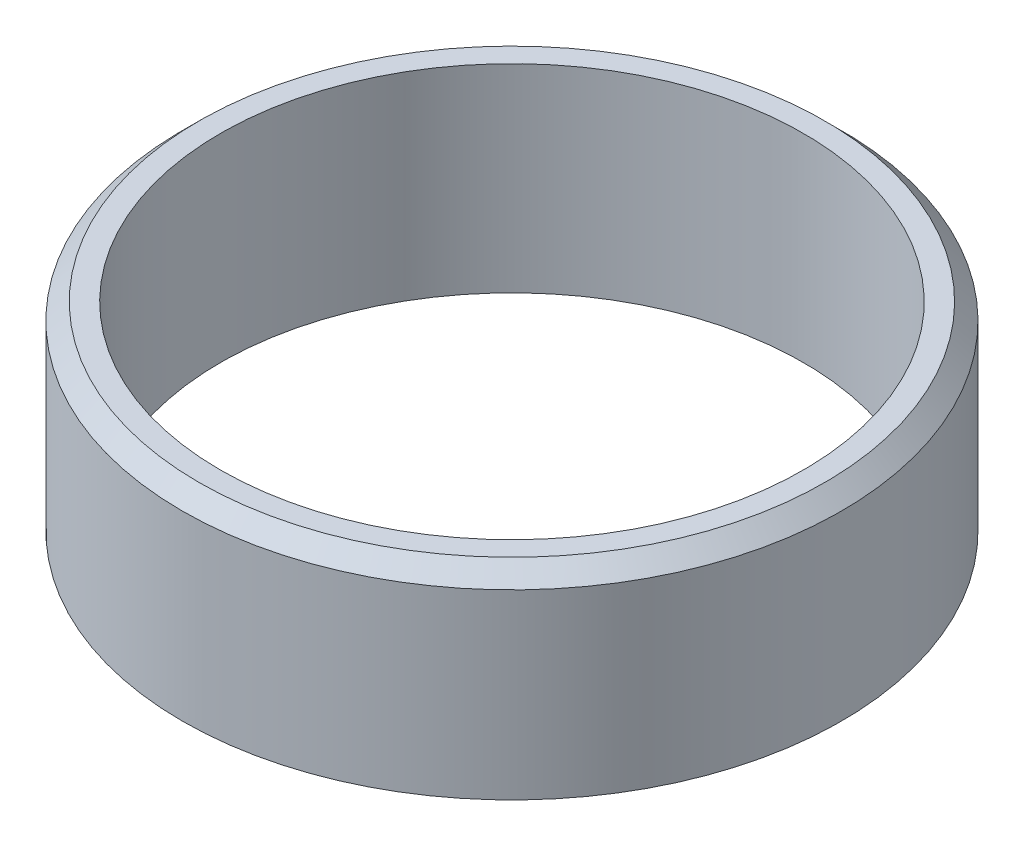
ISO-10303-21;
HEADER;
FILE_DESCRIPTION(('STEP AP214'),'2;1');
FILE_NAME('part.step','',(''),(''),'','','');
FILE_SCHEMA(('AUTOMOTIVE_DESIGN { 1 0 10303 214 1 1 1 1 }'));
ENDSEC;
DATA;
#1=APPLICATION_CONTEXT('core data for automotive mechanical design processes');
#2=APPLICATION_PROTOCOL_DEFINITION('international standard','automotive_design',2000,#1);
#3=PRODUCT_CONTEXT('',#1,'mechanical');
#4=PRODUCT('Part','Part','',(#3));
#5=PRODUCT_RELATED_PRODUCT_CATEGORY('part','',(#4));
#6=PRODUCT_DEFINITION_FORMATION('','',#4);
#7=PRODUCT_DEFINITION_CONTEXT('part definition',#1,'design');
#8=PRODUCT_DEFINITION('design','',#6,#7);
#9=PRODUCT_DEFINITION_SHAPE('','',#8);
#10=(LENGTH_UNIT() NAMED_UNIT(*) SI_UNIT(.MILLI.,.METRE.));
#11=(NAMED_UNIT(*) PLANE_ANGLE_UNIT() SI_UNIT($,.RADIAN.));
#12=(NAMED_UNIT(*) SI_UNIT($,.STERADIAN.) SOLID_ANGLE_UNIT());
#13=UNCERTAINTY_MEASURE_WITH_UNIT(LENGTH_MEASURE(1.E-05),#10,'distance_accuracy_value','');
#14=(GEOMETRIC_REPRESENTATION_CONTEXT(3) GLOBAL_UNCERTAINTY_ASSIGNED_CONTEXT((#13)) GLOBAL_UNIT_ASSIGNED_CONTEXT((#10,
#11,#12)) REPRESENTATION_CONTEXT('',''));
#15=CARTESIAN_POINT('',(0.,0.,0.));
#16=DIRECTION('',(0.,0.,1.));
#17=DIRECTION('',(1.,0.,0.));
#18=AXIS2_PLACEMENT_3D('',#15,#16,#17);
#19=CARTESIAN_POINT('',(0.,12.,0.));
#20=DIRECTION('',(0.,1.,0.));
#21=DIRECTION('',(0.,0.,1.));
#22=AXIS2_PLACEMENT_3D('',#19,#20,#21);
#23=PLANE('',#22);
#24=CARTESIAN_POINT('',(0.,12.,0.));
#25=DIRECTION('',(0.,1.,0.));
#26=DIRECTION('',(0.,0.,1.));
#27=AXIS2_PLACEMENT_3D('',#24,#25,#26);
#28=CIRCLE('',#27,18.925);
#29=CARTESIAN_POINT('',(0.,12.,18.925));
#30=VERTEX_POINT('',#29);
#31=EDGE_CURVE('E47',#30,#30,#28,.T.);
#32=ORIENTED_EDGE('',*,*,#31,.T.);
#33=EDGE_LOOP('',(#32));
#34=FACE_BOUND('',#33,.T.);
#35=CARTESIAN_POINT('',(0.,12.,0.));
#36=DIRECTION('',(0.,1.,0.));
#37=DIRECTION('',(0.,0.,1.));
#38=AXIS2_PLACEMENT_3D('',#35,#36,#37);
#39=CIRCLE('',#38,17.625);
#40=CARTESIAN_POINT('',(0.,12.,17.625));
#41=VERTEX_POINT('',#40);
#42=EDGE_CURVE('E55',#41,#41,#39,.T.);
#43=ORIENTED_EDGE('',*,*,#42,.F.);
#44=EDGE_LOOP('',(#43));
#45=FACE_BOUND('',#44,.T.);
#46=ADVANCED_FACE('F39',(#34,#45),#23,.T.);
#47=CARTESIAN_POINT('',(0.,0.,0.));
#48=DIRECTION('',(0.,1.,0.));
#49=DIRECTION('',(0.,0.,1.));
#50=AXIS2_PLACEMENT_3D('',#47,#48,#49);
#51=PLANE('',#50);
#52=CARTESIAN_POINT('',(0.,0.,0.));
#53=DIRECTION('',(0.,1.,0.));
#54=DIRECTION('',(0.,0.,1.));
#55=AXIS2_PLACEMENT_3D('',#52,#53,#54);
#56=CIRCLE('',#55,19.925);
#57=CARTESIAN_POINT('',(0.,0.,19.925));
#58=VERTEX_POINT('',#57);
#59=EDGE_CURVE('E51',#58,#58,#56,.T.);
#60=ORIENTED_EDGE('',*,*,#59,.F.);
#61=EDGE_LOOP('',(#60));
#62=FACE_BOUND('',#61,.T.);
#63=CARTESIAN_POINT('',(0.,0.,0.));
#64=DIRECTION('',(0.,1.,0.));
#65=DIRECTION('',(0.,0.,1.));
#66=AXIS2_PLACEMENT_3D('',#63,#64,#65);
#67=CIRCLE('',#66,17.625);
#68=CARTESIAN_POINT('',(0.,0.,17.625));
#69=VERTEX_POINT('',#68);
#70=EDGE_CURVE('E58',#69,#69,#67,.T.);
#71=ORIENTED_EDGE('',*,*,#70,.T.);
#72=EDGE_LOOP('',(#71));
#73=FACE_BOUND('',#72,.T.);
#74=ADVANCED_FACE('F68',(#62,#73),#51,.F.);
#75=CARTESIAN_POINT('',(0.,12.,0.));
#76=DIRECTION('',(0.,-1.,0.));
#77=DIRECTION('',(0.,0.,-1.));
#78=AXIS2_PLACEMENT_3D('',#75,#76,#77);
#79=CYLINDRICAL_SURFACE('',#78,19.925);
#80=CARTESIAN_POINT('',(0.,11.,0.));
#81=DIRECTION('',(0.,1.,0.));
#82=DIRECTION('',(0.,0.,1.));
#83=AXIS2_PLACEMENT_3D('',#80,#81,#82);
#84=CIRCLE('',#83,19.925);
#85=CARTESIAN_POINT('',(0.,11.,19.925));
#86=VERTEX_POINT('',#85);
#87=EDGE_CURVE('E10',#86,#86,#84,.F.);
#88=ORIENTED_EDGE('',*,*,#87,.T.);
#89=EDGE_LOOP('',(#88));
#90=FACE_BOUND('',#89,.T.);
#91=ORIENTED_EDGE('',*,*,#59,.T.);
#92=EDGE_LOOP('',(#91));
#93=FACE_BOUND('',#92,.T.);
#94=ADVANCED_FACE('F75',(#90,#93),#79,.T.);
#95=CARTESIAN_POINT('',(0.,12.,0.));
#96=DIRECTION('',(0.,-1.,0.));
#97=DIRECTION('',(0.,0.,-1.));
#98=AXIS2_PLACEMENT_3D('',#95,#96,#97);
#99=CYLINDRICAL_SURFACE('',#98,17.625);
#100=ORIENTED_EDGE('',*,*,#42,.T.);
#101=EDGE_LOOP('',(#100));
#102=FACE_BOUND('',#101,.T.);
#103=ORIENTED_EDGE('',*,*,#70,.F.);
#104=EDGE_LOOP('',(#103));
#105=FACE_BOUND('',#104,.T.);
#106=ADVANCED_FACE('F64',(#102,#105),#99,.F.);
#107=CARTESIAN_POINT('',(0.,12.,0.));
#108=DIRECTION('',(0.,-1.,0.));
#109=DIRECTION('',(0.,0.,-1.));
#110=AXIS2_PLACEMENT_3D('',#107,#108,#109);
#111=CONICAL_SURFACE('',#110,18.925,0.785398163397445);
#112=ORIENTED_EDGE('',*,*,#87,.F.);
#113=EDGE_LOOP('',(#112));
#114=FACE_BOUND('',#113,.T.);
#115=ORIENTED_EDGE('',*,*,#31,.F.);
#116=EDGE_LOOP('',(#115));
#117=FACE_BOUND('',#116,.T.);
#118=ADVANCED_FACE('F42',(#114,#117),#111,.T.);
#119=CLOSED_SHELL('',(#46,#74,#94,#106,#118));
#120=MANIFOLD_SOLID_BREP('B2',#119);
#121=ADVANCED_BREP_SHAPE_REPRESENTATION('',(#18,#120),#14);
#122=SHAPE_DEFINITION_REPRESENTATION(#9,#121);
ENDSEC;
END-ISO-10303-21;
